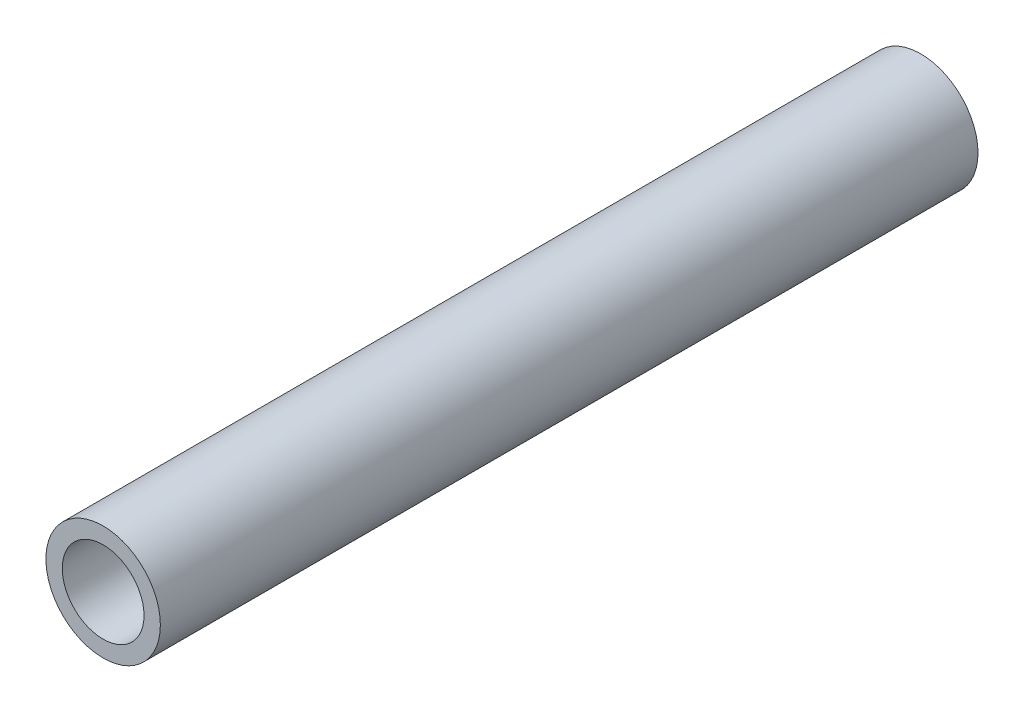
ISO-10303-21;
HEADER;
FILE_DESCRIPTION(('STEP AP214'),'2;1');
FILE_NAME('part.step','',(''),(''),'','','');
FILE_SCHEMA(('AUTOMOTIVE_DESIGN { 1 0 10303 214 1 1 1 1 }'));
ENDSEC;
DATA;
#1=APPLICATION_CONTEXT('core data for automotive mechanical design processes');
#2=APPLICATION_PROTOCOL_DEFINITION('international standard','automotive_design',2000,#1);
#3=PRODUCT_CONTEXT('',#1,'mechanical');
#4=PRODUCT('Part','Part','',(#3));
#5=PRODUCT_RELATED_PRODUCT_CATEGORY('part','',(#4));
#6=PRODUCT_DEFINITION_FORMATION('','',#4);
#7=PRODUCT_DEFINITION_CONTEXT('part definition',#1,'design');
#8=PRODUCT_DEFINITION('design','',#6,#7);
#9=PRODUCT_DEFINITION_SHAPE('','',#8);
#10=(LENGTH_UNIT() NAMED_UNIT(*) SI_UNIT(.MILLI.,.METRE.));
#11=(NAMED_UNIT(*) PLANE_ANGLE_UNIT() SI_UNIT($,.RADIAN.));
#12=(NAMED_UNIT(*) SI_UNIT($,.STERADIAN.) SOLID_ANGLE_UNIT());
#13=UNCERTAINTY_MEASURE_WITH_UNIT(LENGTH_MEASURE(1.E-05),#10,'distance_accuracy_value','');
#14=(GEOMETRIC_REPRESENTATION_CONTEXT(3) GLOBAL_UNCERTAINTY_ASSIGNED_CONTEXT((#13)) GLOBAL_UNIT_ASSIGNED_CONTEXT((#10,
#11,#12)) REPRESENTATION_CONTEXT('',''));
#15=CARTESIAN_POINT('',(0.,0.,0.));
#16=DIRECTION('',(0.,0.,1.));
#17=DIRECTION('',(1.,0.,0.));
#18=AXIS2_PLACEMENT_3D('',#15,#16,#17);
#19=CARTESIAN_POINT('',(0.,0.,50.));
#20=DIRECTION('',(0.,0.,1.));
#21=DIRECTION('',(1.,0.,0.));
#22=AXIS2_PLACEMENT_3D('',#19,#20,#21);
#23=PLANE('',#22);
#24=CARTESIAN_POINT('',(0.,0.,50.));
#25=DIRECTION('',(0.,0.,1.));
#26=DIRECTION('',(1.,0.,0.));
#27=AXIS2_PLACEMENT_3D('',#24,#25,#26);
#28=CIRCLE('',#27,3.5);
#29=CARTESIAN_POINT('',(3.5,0.,50.));
#30=VERTEX_POINT('',#29);
#31=EDGE_CURVE('E10',#30,#30,#28,.T.);
#32=ORIENTED_EDGE('',*,*,#31,.T.);
#33=EDGE_LOOP('',(#32));
#34=FACE_BOUND('',#33,.T.);
#35=CARTESIAN_POINT('',(0.,0.,50.));
#36=DIRECTION('',(0.,0.,1.));
#37=DIRECTION('',(1.,0.,0.));
#38=AXIS2_PLACEMENT_3D('',#35,#36,#37);
#39=CIRCLE('',#38,2.5);
#40=CARTESIAN_POINT('',(2.5,0.,50.));
#41=VERTEX_POINT('',#40);
#42=EDGE_CURVE('E42',#41,#41,#39,.T.);
#43=ORIENTED_EDGE('',*,*,#42,.F.);
#44=EDGE_LOOP('',(#43));
#45=FACE_BOUND('',#44,.T.);
#46=ADVANCED_FACE('F31',(#34,#45),#23,.T.);
#47=CARTESIAN_POINT('',(0.,0.,0.));
#48=DIRECTION('',(0.,0.,1.));
#49=DIRECTION('',(1.,0.,0.));
#50=AXIS2_PLACEMENT_3D('',#47,#48,#49);
#51=PLANE('',#50);
#52=CARTESIAN_POINT('',(0.,0.,0.));
#53=DIRECTION('',(0.,0.,1.));
#54=DIRECTION('',(1.,0.,0.));
#55=AXIS2_PLACEMENT_3D('',#52,#53,#54);
#56=CIRCLE('',#55,3.5);
#57=CARTESIAN_POINT('',(3.5,0.,0.));
#58=VERTEX_POINT('',#57);
#59=EDGE_CURVE('E35',#58,#58,#56,.T.);
#60=ORIENTED_EDGE('',*,*,#59,.F.);
#61=EDGE_LOOP('',(#60));
#62=FACE_BOUND('',#61,.T.);
#63=CARTESIAN_POINT('',(0.,0.,0.));
#64=DIRECTION('',(0.,0.,1.));
#65=DIRECTION('',(1.,0.,0.));
#66=AXIS2_PLACEMENT_3D('',#63,#64,#65);
#67=CIRCLE('',#66,2.5);
#68=CARTESIAN_POINT('',(2.5,0.,0.));
#69=VERTEX_POINT('',#68);
#70=EDGE_CURVE('E44',#69,#69,#67,.T.);
#71=ORIENTED_EDGE('',*,*,#70,.T.);
#72=EDGE_LOOP('',(#71));
#73=FACE_BOUND('',#72,.T.);
#74=ADVANCED_FACE('F54',(#62,#73),#51,.F.);
#75=CARTESIAN_POINT('',(0.,0.,50.));
#76=DIRECTION('',(0.,0.,-1.));
#77=DIRECTION('',(-1.,0.,0.));
#78=AXIS2_PLACEMENT_3D('',#75,#76,#77);
#79=CYLINDRICAL_SURFACE('',#78,3.5);
#80=ORIENTED_EDGE('',*,*,#31,.F.);
#81=EDGE_LOOP('',(#80));
#82=FACE_BOUND('',#81,.T.);
#83=ORIENTED_EDGE('',*,*,#59,.T.);
#84=EDGE_LOOP('',(#83));
#85=FACE_BOUND('',#84,.T.);
#86=ADVANCED_FACE('F33',(#82,#85),#79,.T.);
#87=CARTESIAN_POINT('',(0.,0.,50.));
#88=DIRECTION('',(0.,0.,-1.));
#89=DIRECTION('',(-1.,0.,0.));
#90=AXIS2_PLACEMENT_3D('',#87,#88,#89);
#91=CYLINDRICAL_SURFACE('',#90,2.5);
#92=ORIENTED_EDGE('',*,*,#42,.T.);
#93=EDGE_LOOP('',(#92));
#94=FACE_BOUND('',#93,.T.);
#95=ORIENTED_EDGE('',*,*,#70,.F.);
#96=EDGE_LOOP('',(#95));
#97=FACE_BOUND('',#96,.T.);
#98=ADVANCED_FACE('F50',(#94,#97),#91,.F.);
#99=CLOSED_SHELL('',(#46,#74,#86,#98));
#100=MANIFOLD_SOLID_BREP('B2',#99);
#101=ADVANCED_BREP_SHAPE_REPRESENTATION('',(#18,#100),#14);
#102=SHAPE_DEFINITION_REPRESENTATION(#9,#101);
ENDSEC;
END-ISO-10303-21;
